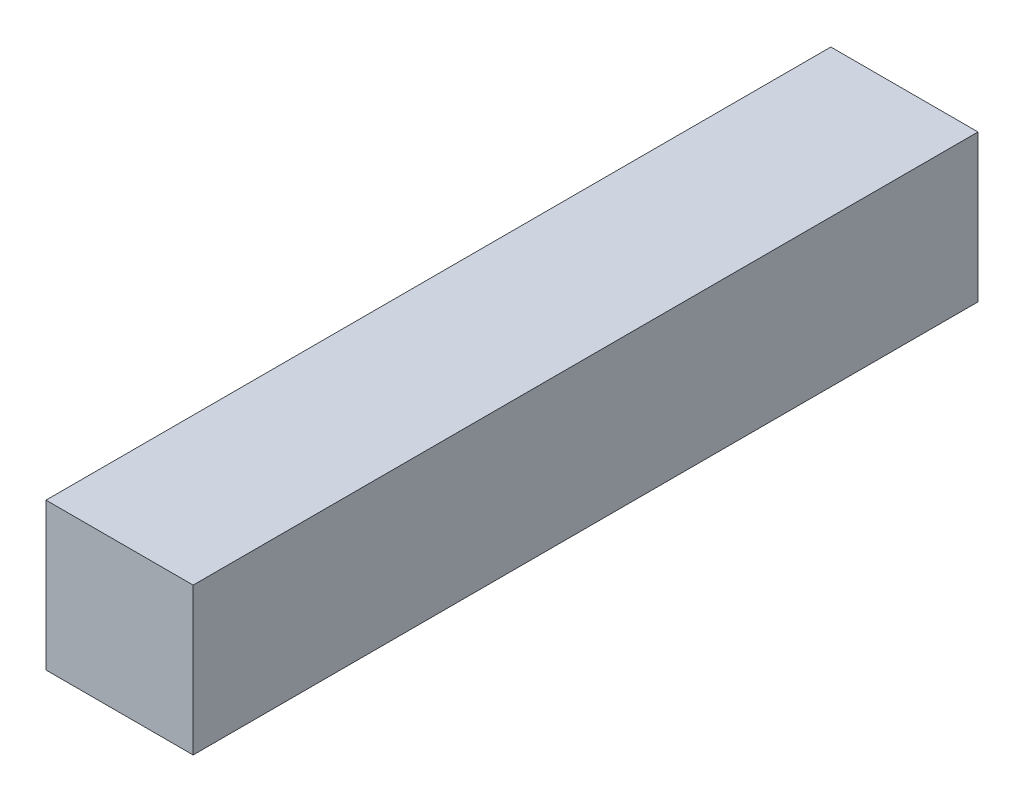
ISO-10303-21;
HEADER;
FILE_DESCRIPTION(('STEP AP214'),'2;1');
FILE_NAME('part.step','',(''),(''),'','','');
FILE_SCHEMA(('AUTOMOTIVE_DESIGN { 1 0 10303 214 1 1 1 1 }'));
ENDSEC;
DATA;
#1=APPLICATION_CONTEXT('core data for automotive mechanical design processes');
#2=APPLICATION_PROTOCOL_DEFINITION('international standard','automotive_design',2000,#1);
#3=PRODUCT_CONTEXT('',#1,'mechanical');
#4=PRODUCT('Part','Part','',(#3));
#5=PRODUCT_RELATED_PRODUCT_CATEGORY('part','',(#4));
#6=PRODUCT_DEFINITION_FORMATION('','',#4);
#7=PRODUCT_DEFINITION_CONTEXT('part definition',#1,'design');
#8=PRODUCT_DEFINITION('design','',#6,#7);
#9=PRODUCT_DEFINITION_SHAPE('','',#8);
#10=(LENGTH_UNIT() NAMED_UNIT(*) SI_UNIT(.MILLI.,.METRE.));
#11=(NAMED_UNIT(*) PLANE_ANGLE_UNIT() SI_UNIT($,.RADIAN.));
#12=(NAMED_UNIT(*) SI_UNIT($,.STERADIAN.) SOLID_ANGLE_UNIT());
#13=UNCERTAINTY_MEASURE_WITH_UNIT(LENGTH_MEASURE(1.E-05),#10,'distance_accuracy_value','');
#14=(GEOMETRIC_REPRESENTATION_CONTEXT(3) GLOBAL_UNCERTAINTY_ASSIGNED_CONTEXT((#13)) GLOBAL_UNIT_ASSIGNED_CONTEXT((#10,
#11,#12)) REPRESENTATION_CONTEXT('',''));
#15=CARTESIAN_POINT('',(0.,0.,0.));
#16=DIRECTION('',(0.,0.,1.));
#17=DIRECTION('',(1.,0.,0.));
#18=AXIS2_PLACEMENT_3D('',#15,#16,#17);
#19=CARTESIAN_POINT('',(2.38125,-2.38125,25.4));
#20=DIRECTION('',(-1.,0.,0.));
#21=DIRECTION('',(0.,0.,1.));
#22=AXIS2_PLACEMENT_3D('',#19,#20,#21);
#23=PLANE('',#22);
#24=DIRECTION('',(0.,1.,0.));
#25=VECTOR('',#24,1.);
#26=CARTESIAN_POINT('',(2.38125,-2.38125,0.));
#27=LINE('',#26,#25);
#28=CARTESIAN_POINT('',(2.38125,-2.38125,0.));
#29=VERTEX_POINT('',#28);
#30=CARTESIAN_POINT('',(2.38125,2.38125,0.));
#31=VERTEX_POINT('',#30);
#32=EDGE_CURVE('E97',#29,#31,#27,.T.);
#33=ORIENTED_EDGE('',*,*,#32,.T.);
#34=DIRECTION('',(0.,0.,-1.));
#35=VECTOR('',#34,1.);
#36=CARTESIAN_POINT('',(2.38125,2.38125,25.4));
#37=LINE('',#36,#35);
#38=CARTESIAN_POINT('',(2.38125,2.38125,25.4));
#39=VERTEX_POINT('',#38);
#40=EDGE_CURVE('E11',#39,#31,#37,.T.);
#41=ORIENTED_EDGE('',*,*,#40,.F.);
#42=DIRECTION('',(0.,1.,0.));
#43=VECTOR('',#42,1.);
#44=CARTESIAN_POINT('',(2.38125,-2.38125,25.4));
#45=LINE('',#44,#43);
#46=CARTESIAN_POINT('',(2.38125,-2.38125,25.4));
#47=VERTEX_POINT('',#46);
#48=EDGE_CURVE('E85',#47,#39,#45,.T.);
#49=ORIENTED_EDGE('',*,*,#48,.F.);
#50=DIRECTION('',(0.,0.,-1.));
#51=VECTOR('',#50,1.);
#52=CARTESIAN_POINT('',(2.38125,-2.38125,25.4));
#53=LINE('',#52,#51);
#54=EDGE_CURVE('E93',#47,#29,#53,.T.);
#55=ORIENTED_EDGE('',*,*,#54,.T.);
#56=EDGE_LOOP('',(#33,#41,#49,#55));
#57=FACE_BOUND('',#56,.T.);
#58=ADVANCED_FACE('F34',(#57),#23,.F.);
#59=CARTESIAN_POINT('',(-2.38125,2.38125,25.4));
#60=DIRECTION('',(0.,-1.,0.));
#61=DIRECTION('',(0.,0.,-1.));
#62=AXIS2_PLACEMENT_3D('',#59,#60,#61);
#63=PLANE('',#62);
#64=DIRECTION('',(-1.,0.,0.));
#65=VECTOR('',#64,1.);
#66=CARTESIAN_POINT('',(-2.38125,2.38125,0.));
#67=LINE('',#66,#65);
#68=CARTESIAN_POINT('',(-2.38125,2.38125,0.));
#69=VERTEX_POINT('',#68);
#70=EDGE_CURVE('E89',#31,#69,#67,.T.);
#71=ORIENTED_EDGE('',*,*,#70,.T.);
#72=DIRECTION('',(0.,0.,-1.));
#73=VECTOR('',#72,1.);
#74=CARTESIAN_POINT('',(-2.38125,2.38125,25.4));
#75=LINE('',#74,#73);
#76=CARTESIAN_POINT('',(-2.38125,2.38125,25.4));
#77=VERTEX_POINT('',#76);
#78=EDGE_CURVE('E42',#77,#69,#75,.T.);
#79=ORIENTED_EDGE('',*,*,#78,.F.);
#80=DIRECTION('',(-1.,0.,0.));
#81=VECTOR('',#80,1.);
#82=CARTESIAN_POINT('',(-2.38125,2.38125,25.4));
#83=LINE('',#82,#81);
#84=EDGE_CURVE('E80',#39,#77,#83,.T.);
#85=ORIENTED_EDGE('',*,*,#84,.F.);
#86=ORIENTED_EDGE('',*,*,#40,.T.);
#87=EDGE_LOOP('',(#71,#79,#85,#86));
#88=FACE_BOUND('',#87,.T.);
#89=ADVANCED_FACE('F88',(#88),#63,.F.);
#90=CARTESIAN_POINT('',(-2.38125,-2.38125,25.4));
#91=DIRECTION('',(1.,0.,0.));
#92=DIRECTION('',(0.,0.,-1.));
#93=AXIS2_PLACEMENT_3D('',#90,#91,#92);
#94=PLANE('',#93);
#95=DIRECTION('',(0.,-1.,0.));
#96=VECTOR('',#95,1.);
#97=CARTESIAN_POINT('',(-2.38125,-2.38125,0.));
#98=LINE('',#97,#96);
#99=CARTESIAN_POINT('',(-2.38125,-2.38125,0.));
#100=VERTEX_POINT('',#99);
#101=EDGE_CURVE('E67',#69,#100,#98,.T.);
#102=ORIENTED_EDGE('',*,*,#101,.T.);
#103=DIRECTION('',(0.,0.,-1.));
#104=VECTOR('',#103,1.);
#105=CARTESIAN_POINT('',(-2.38125,-2.38125,25.4));
#106=LINE('',#105,#104);
#107=CARTESIAN_POINT('',(-2.38125,-2.38125,25.4));
#108=VERTEX_POINT('',#107);
#109=EDGE_CURVE('E90',#108,#100,#106,.T.);
#110=ORIENTED_EDGE('',*,*,#109,.F.);
#111=DIRECTION('',(0.,-1.,0.));
#112=VECTOR('',#111,1.);
#113=CARTESIAN_POINT('',(-2.38125,-2.38125,25.4));
#114=LINE('',#113,#112);
#115=EDGE_CURVE('E83',#77,#108,#114,.T.);
#116=ORIENTED_EDGE('',*,*,#115,.F.);
#117=ORIENTED_EDGE('',*,*,#78,.T.);
#118=EDGE_LOOP('',(#102,#110,#116,#117));
#119=FACE_BOUND('',#118,.T.);
#120=ADVANCED_FACE('F91',(#119),#94,.F.);
#121=CARTESIAN_POINT('',(-2.38125,-2.38125,25.4));
#122=DIRECTION('',(0.,1.,0.));
#123=DIRECTION('',(0.,0.,1.));
#124=AXIS2_PLACEMENT_3D('',#121,#122,#123);
#125=PLANE('',#124);
#126=DIRECTION('',(1.,0.,0.));
#127=VECTOR('',#126,1.);
#128=CARTESIAN_POINT('',(-2.38125,-2.38125,0.));
#129=LINE('',#128,#127);
#130=EDGE_CURVE('E73',#100,#29,#129,.T.);
#131=ORIENTED_EDGE('',*,*,#130,.T.);
#132=ORIENTED_EDGE('',*,*,#54,.F.);
#133=DIRECTION('',(1.,0.,0.));
#134=VECTOR('',#133,1.);
#135=CARTESIAN_POINT('',(-2.38125,-2.38125,25.4));
#136=LINE('',#135,#134);
#137=EDGE_CURVE('E50',#108,#47,#136,.T.);
#138=ORIENTED_EDGE('',*,*,#137,.F.);
#139=ORIENTED_EDGE('',*,*,#109,.T.);
#140=EDGE_LOOP('',(#131,#132,#138,#139));
#141=FACE_BOUND('',#140,.T.);
#142=ADVANCED_FACE('F104',(#141),#125,.F.);
#143=CARTESIAN_POINT('',(0.,0.,25.4));
#144=DIRECTION('',(0.,0.,-1.));
#145=DIRECTION('',(-1.,0.,0.));
#146=AXIS2_PLACEMENT_3D('',#143,#144,#145);
#147=PLANE('',#146);
#148=ORIENTED_EDGE('',*,*,#48,.T.);
#149=ORIENTED_EDGE('',*,*,#84,.T.);
#150=ORIENTED_EDGE('',*,*,#115,.T.);
#151=ORIENTED_EDGE('',*,*,#137,.T.);
#152=EDGE_LOOP('',(#148,#149,#150,#151));
#153=FACE_BOUND('',#152,.T.);
#154=ADVANCED_FACE('F81',(#153),#147,.F.);
#155=CARTESIAN_POINT('',(0.,0.,0.));
#156=DIRECTION('',(0.,0.,-1.));
#157=DIRECTION('',(-1.,0.,0.));
#158=AXIS2_PLACEMENT_3D('',#155,#156,#157);
#159=PLANE('',#158);
#160=ORIENTED_EDGE('',*,*,#32,.F.);
#161=ORIENTED_EDGE('',*,*,#130,.F.);
#162=ORIENTED_EDGE('',*,*,#101,.F.);
#163=ORIENTED_EDGE('',*,*,#70,.F.);
#164=EDGE_LOOP('',(#160,#161,#162,#163));
#165=FACE_BOUND('',#164,.T.);
#166=ADVANCED_FACE('F107',(#165),#159,.T.);
#167=CLOSED_SHELL('',(#58,#89,#120,#142,#154,#166));
#168=MANIFOLD_SOLID_BREP('B2',#167);
#169=ADVANCED_BREP_SHAPE_REPRESENTATION('',(#18,#168),#14);
#170=SHAPE_DEFINITION_REPRESENTATION(#9,#169);
ENDSEC;
END-ISO-10303-21;
